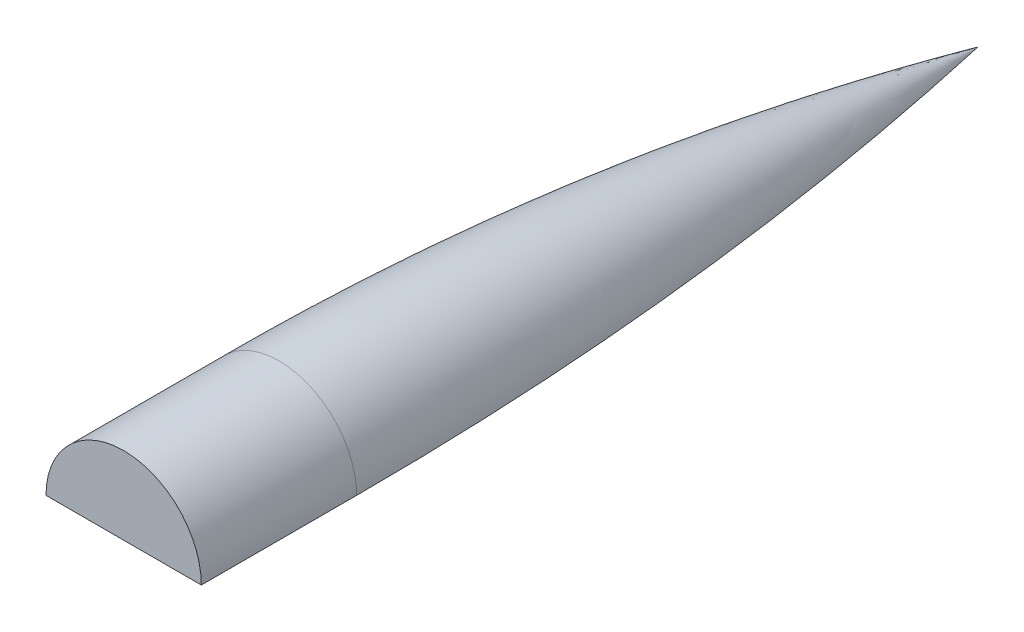
ISO-10303-21;
HEADER;
FILE_DESCRIPTION(('STEP AP214'),'2;1');
FILE_NAME('part.step','',(''),(''),'','','');
FILE_SCHEMA(('AUTOMOTIVE_DESIGN { 1 0 10303 214 1 1 1 1 }'));
ENDSEC;
DATA;
#1=APPLICATION_CONTEXT('core data for automotive mechanical design processes');
#2=APPLICATION_PROTOCOL_DEFINITION('international standard','automotive_design',2000,#1);
#3=PRODUCT_CONTEXT('',#1,'mechanical');
#4=PRODUCT('Part','Part','',(#3));
#5=PRODUCT_RELATED_PRODUCT_CATEGORY('part','',(#4));
#6=PRODUCT_DEFINITION_FORMATION('','',#4);
#7=PRODUCT_DEFINITION_CONTEXT('part definition',#1,'design');
#8=PRODUCT_DEFINITION('design','',#6,#7);
#9=PRODUCT_DEFINITION_SHAPE('','',#8);
#10=(LENGTH_UNIT() NAMED_UNIT(*) SI_UNIT(.MILLI.,.METRE.));
#11=(NAMED_UNIT(*) PLANE_ANGLE_UNIT() SI_UNIT($,.RADIAN.));
#12=(NAMED_UNIT(*) SI_UNIT($,.STERADIAN.) SOLID_ANGLE_UNIT());
#13=UNCERTAINTY_MEASURE_WITH_UNIT(LENGTH_MEASURE(1.E-05),#10,'distance_accuracy_value','');
#14=(GEOMETRIC_REPRESENTATION_CONTEXT(3) GLOBAL_UNCERTAINTY_ASSIGNED_CONTEXT((#13)) GLOBAL_UNIT_ASSIGNED_CONTEXT((#10,
#11,#12)) REPRESENTATION_CONTEXT('',''));
#15=CARTESIAN_POINT('',(0.,0.,0.));
#16=DIRECTION('',(0.,0.,1.));
#17=DIRECTION('',(1.,0.,0.));
#18=AXIS2_PLACEMENT_3D('',#15,#16,#17);
#19=CARTESIAN_POINT('',(-3047.99999999998,0.,0.));
#20=DIRECTION('',(0.,-1.,0.));
#21=DIRECTION('',(1.,0.,0.));
#22=AXIS2_PLACEMENT_3D('',#19,#20,#21);
#23=CIRCLE('',#22,3124.19999999998);
#24=TRIMMED_CURVE('',#23,(PARAMETER_VALUE(-0.221314442347792)),
(PARAMETER_VALUE(0.221314442347792)),.T.,.PARAMETER.);
#25=CARTESIAN_POINT('',(0.,0.,0.));
#26=DIRECTION('',(0.,0.,1.));
#27=AXIS1_PLACEMENT('',#25,#26);
#28=SURFACE_OF_REVOLUTION('',#24,#27);
#29=CARTESIAN_POINT('',(0.,0.,0.));
#30=DIRECTION('',(0.,0.,1.));
#31=DIRECTION('',(1.,0.,0.));
#32=AXIS2_PLACEMENT_3D('',#29,#30,#31);
#33=CIRCLE('',#32,76.2);
#34=CARTESIAN_POINT('',(76.2,-5.32101756039693E-13,0.));
#35=VERTEX_POINT('',#34);
#36=CARTESIAN_POINT('',(-76.2,0.,0.));
#37=VERTEX_POINT('',#36);
#38=EDGE_CURVE('E11',#35,#37,#33,.T.);
#39=ORIENTED_EDGE('',*,*,#38,.F.);
#40=CARTESIAN_POINT('',(-3047.99999999998,2.12840702415876E-11,0.));
#41=DIRECTION('',(0.,-1.,0.));
#42=DIRECTION('',(0.,0.,1.));
#43=AXIS2_PLACEMENT_3D('',#40,#41,#42);
#44=CIRCLE('',#43,3124.19999999998);
#45=CARTESIAN_POINT('',(0.,0.,-685.8));
#46=VERTEX_POINT('',#45);
#47=EDGE_CURVE('E68',#46,#35,#44,.T.);
#48=ORIENTED_EDGE('',*,*,#47,.F.);
#49=CARTESIAN_POINT('',(3047.99999999998,0.,0.));
#50=DIRECTION('',(0.,1.,0.));
#51=DIRECTION('',(0.,0.,1.));
#52=AXIS2_PLACEMENT_3D('',#49,#50,#51);
#53=CIRCLE('',#52,3124.19999999998);
#54=EDGE_CURVE('E67',#46,#37,#53,.T.);
#55=ORIENTED_EDGE('',*,*,#54,.T.);
#56=EDGE_LOOP('',(#39,#48,#55));
#57=FACE_BOUND('',#56,.T.);
#58=ADVANCED_FACE('F35',(#57),#28,.T.);
#59=CARTESIAN_POINT('',(0.,0.,0.));
#60=DIRECTION('',(0.,0.,1.));
#61=DIRECTION('',(1.,0.,0.));
#62=AXIS2_PLACEMENT_3D('',#59,#60,#61);
#63=CYLINDRICAL_SURFACE('',#62,76.2);
#64=CARTESIAN_POINT('',(0.,0.,152.4));
#65=DIRECTION('',(0.,0.,1.));
#66=DIRECTION('',(1.,0.,0.));
#67=AXIS2_PLACEMENT_3D('',#64,#65,#66);
#68=CIRCLE('',#67,76.2);
#69=CARTESIAN_POINT('',(76.2,-5.32101756039693E-13,152.4));
#70=VERTEX_POINT('',#69);
#71=CARTESIAN_POINT('',(-76.2,0.,152.4));
#72=VERTEX_POINT('',#71);
#73=EDGE_CURVE('E42',#70,#72,#68,.T.);
#74=ORIENTED_EDGE('',*,*,#73,.F.);
#75=DIRECTION('',(0.,0.,1.));
#76=VECTOR('',#75,1.);
#77=CARTESIAN_POINT('',(76.2,-5.32101756039693E-13,0.));
#78=LINE('',#77,#76);
#79=EDGE_CURVE('E66',#35,#70,#78,.T.);
#80=ORIENTED_EDGE('',*,*,#79,.F.);
#81=ORIENTED_EDGE('',*,*,#38,.T.);
#82=DIRECTION('',(0.,0.,1.));
#83=VECTOR('',#82,1.);
#84=CARTESIAN_POINT('',(-76.2,0.,0.));
#85=LINE('',#84,#83);
#86=EDGE_CURVE('E65',#37,#72,#85,.T.);
#87=ORIENTED_EDGE('',*,*,#86,.T.);
#88=EDGE_LOOP('',(#74,#80,#81,#87));
#89=FACE_BOUND('',#88,.T.);
#90=ADVANCED_FACE('F63',(#89),#63,.T.);
#91=CARTESIAN_POINT('',(0.,0.,152.4));
#92=DIRECTION('',(0.,0.,-1.));
#93=DIRECTION('',(-1.,0.,0.));
#94=AXIS2_PLACEMENT_3D('',#91,#92,#93);
#95=PLANE('',#94);
#96=DIRECTION('',(-1.,0.,0.));
#97=VECTOR('',#96,1.);
#98=CARTESIAN_POINT('',(0.,0.,152.4));
#99=LINE('',#98,#97);
#100=EDGE_CURVE('E73',#70,#72,#99,.T.);
#101=ORIENTED_EDGE('',*,*,#100,.F.);
#102=ORIENTED_EDGE('',*,*,#73,.T.);
#103=EDGE_LOOP('',(#101,#102));
#104=FACE_BOUND('',#103,.T.);
#105=ADVANCED_FACE('F79',(#104),#95,.F.);
#106=CARTESIAN_POINT('',(0.,0.,0.));
#107=DIRECTION('',(0.,-1.,0.));
#108=DIRECTION('',(0.,0.,1.));
#109=AXIS2_PLACEMENT_3D('',#106,#107,#108);
#110=PLANE('',#109);
#111=ORIENTED_EDGE('',*,*,#100,.T.);
#112=ORIENTED_EDGE('',*,*,#86,.F.);
#113=ORIENTED_EDGE('',*,*,#54,.F.);
#114=ORIENTED_EDGE('',*,*,#47,.T.);
#115=ORIENTED_EDGE('',*,*,#79,.T.);
#116=EDGE_LOOP('',(#111,#112,#113,#114,#115));
#117=FACE_BOUND('',#116,.T.);
#118=ADVANCED_FACE('F71',(#117),#110,.T.);
#119=CLOSED_SHELL('',(#58,#90,#105,#118));
#120=MANIFOLD_SOLID_BREP('B2',#119);
#121=ADVANCED_BREP_SHAPE_REPRESENTATION('',(#18,#120),#14);
#122=SHAPE_DEFINITION_REPRESENTATION(#9,#121);
ENDSEC;
END-ISO-10303-21;
